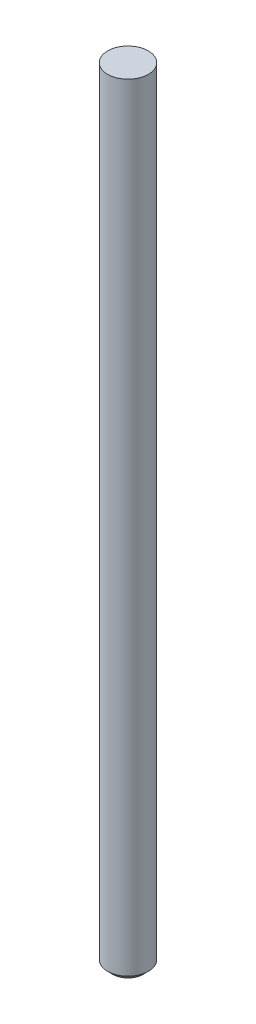
ISO-10303-21;
HEADER;
FILE_DESCRIPTION(('STEP AP214'),'2;1');
FILE_NAME('part.step','',(''),(''),'','','');
FILE_SCHEMA(('AUTOMOTIVE_DESIGN { 1 0 10303 214 1 1 1 1 }'));
ENDSEC;
DATA;
#1=APPLICATION_CONTEXT('core data for automotive mechanical design processes');
#2=APPLICATION_PROTOCOL_DEFINITION('international standard','automotive_design',2000,#1);
#3=PRODUCT_CONTEXT('',#1,'mechanical');
#4=PRODUCT('Part','Part','',(#3));
#5=PRODUCT_RELATED_PRODUCT_CATEGORY('part','',(#4));
#6=PRODUCT_DEFINITION_FORMATION('','',#4);
#7=PRODUCT_DEFINITION_CONTEXT('part definition',#1,'design');
#8=PRODUCT_DEFINITION('design','',#6,#7);
#9=PRODUCT_DEFINITION_SHAPE('','',#8);
#10=(LENGTH_UNIT() NAMED_UNIT(*) SI_UNIT(.MILLI.,.METRE.));
#11=(NAMED_UNIT(*) PLANE_ANGLE_UNIT() SI_UNIT($,.RADIAN.));
#12=(NAMED_UNIT(*) SI_UNIT($,.STERADIAN.) SOLID_ANGLE_UNIT());
#13=UNCERTAINTY_MEASURE_WITH_UNIT(LENGTH_MEASURE(1.E-05),#10,'distance_accuracy_value','');
#14=(GEOMETRIC_REPRESENTATION_CONTEXT(3) GLOBAL_UNCERTAINTY_ASSIGNED_CONTEXT((#13)) GLOBAL_UNIT_ASSIGNED_CONTEXT((#10,
#11,#12)) REPRESENTATION_CONTEXT('',''));
#15=CARTESIAN_POINT('',(0.,0.,0.));
#16=DIRECTION('',(0.,0.,1.));
#17=DIRECTION('',(1.,0.,0.));
#18=AXIS2_PLACEMENT_3D('',#15,#16,#17);
#19=CARTESIAN_POINT('',(0.,150.,0.));
#20=DIRECTION('',(0.,-1.,0.));
#21=DIRECTION('',(0.,0.,-1.));
#22=AXIS2_PLACEMENT_3D('',#19,#20,#21);
#23=CYLINDRICAL_SURFACE('',#22,3.9);
#24=CARTESIAN_POINT('',(0.,1.00000000000003,0.));
#25=DIRECTION('',(0.,1.,0.));
#26=DIRECTION('',(0.,0.,1.));
#27=AXIS2_PLACEMENT_3D('',#24,#25,#26);
#28=CIRCLE('',#27,3.9);
#29=CARTESIAN_POINT('',(0.,1.00000000000003,3.9));
#30=VERTEX_POINT('',#29);
#31=EDGE_CURVE('E54',#30,#30,#28,.T.);
#32=ORIENTED_EDGE('',*,*,#31,.T.);
#33=EDGE_LOOP('',(#32));
#34=FACE_BOUND('',#33,.T.);
#35=CARTESIAN_POINT('',(0.,150.,0.));
#36=DIRECTION('',(0.,1.,0.));
#37=DIRECTION('',(0.,0.,1.));
#38=AXIS2_PLACEMENT_3D('',#35,#36,#37);
#39=CIRCLE('',#38,3.9);
#40=CARTESIAN_POINT('',(0.,150.,3.9));
#41=VERTEX_POINT('',#40);
#42=EDGE_CURVE('E58',#41,#41,#39,.T.);
#43=ORIENTED_EDGE('',*,*,#42,.F.);
#44=EDGE_LOOP('',(#43));
#45=FACE_BOUND('',#44,.T.);
#46=ADVANCED_FACE('F46',(#34,#45),#23,.T.);
#47=CARTESIAN_POINT('',(0.,150.,0.));
#48=DIRECTION('',(0.,1.,0.));
#49=DIRECTION('',(0.,0.,1.));
#50=AXIS2_PLACEMENT_3D('',#47,#48,#49);
#51=PLANE('',#50);
#52=ORIENTED_EDGE('',*,*,#42,.T.);
#53=EDGE_LOOP('',(#52));
#54=FACE_BOUND('',#53,.T.);
#55=ADVANCED_FACE('F65',(#54),#51,.T.);
#56=CARTESIAN_POINT('',(0.,0.,0.));
#57=DIRECTION('',(0.,1.,0.));
#58=DIRECTION('',(0.,0.,1.));
#59=AXIS2_PLACEMENT_3D('',#56,#57,#58);
#60=PLANE('',#59);
#61=CARTESIAN_POINT('',(0.,0.,0.));
#62=DIRECTION('',(0.,1.,0.));
#63=DIRECTION('',(0.,0.,1.));
#64=AXIS2_PLACEMENT_3D('',#61,#62,#63);
#65=CIRCLE('',#64,2.89999999999997);
#66=CARTESIAN_POINT('',(0.,0.,2.89999999999997));
#67=VERTEX_POINT('',#66);
#68=EDGE_CURVE('E10',#67,#67,#65,.F.);
#69=ORIENTED_EDGE('',*,*,#68,.T.);
#70=EDGE_LOOP('',(#69));
#71=FACE_BOUND('',#70,.T.);
#72=ADVANCED_FACE('F71',(#71),#60,.F.);
#73=CARTESIAN_POINT('',(0.,1.00000000000003,0.));
#74=DIRECTION('',(0.,1.,0.));
#75=DIRECTION('',(0.,0.,1.));
#76=AXIS2_PLACEMENT_3D('',#73,#74,#75);
#77=CONICAL_SURFACE('',#76,3.9,0.785398163397448);
#78=ORIENTED_EDGE('',*,*,#68,.F.);
#79=EDGE_LOOP('',(#78));
#80=FACE_BOUND('',#79,.T.);
#81=ORIENTED_EDGE('',*,*,#31,.F.);
#82=EDGE_LOOP('',(#81));
#83=FACE_BOUND('',#82,.T.);
#84=ADVANCED_FACE('F49',(#80,#83),#77,.T.);
#85=CLOSED_SHELL('',(#46,#55,#72,#84));
#86=MANIFOLD_SOLID_BREP('B2',#85);
#87=ADVANCED_BREP_SHAPE_REPRESENTATION('',(#18,#86),#14);
#88=SHAPE_DEFINITION_REPRESENTATION(#9,#87);
ENDSEC;
END-ISO-10303-21;
